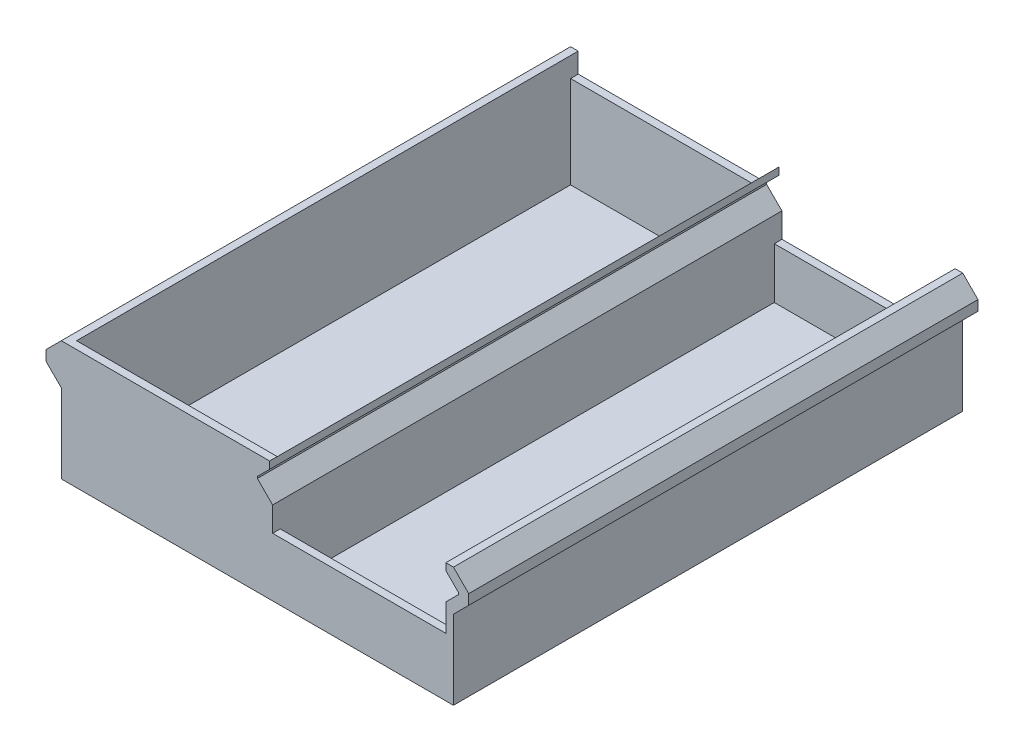
ISO-10303-21;
HEADER;
FILE_DESCRIPTION(('STEP AP214'),'2;1');
FILE_NAME('part.step','',(''),(''),'','','');
FILE_SCHEMA(('AUTOMOTIVE_DESIGN { 1 0 10303 214 1 1 1 1 }'));
ENDSEC;
DATA;
#1=APPLICATION_CONTEXT('core data for automotive mechanical design processes');
#2=APPLICATION_PROTOCOL_DEFINITION('international standard','automotive_design',2000,#1);
#3=PRODUCT_CONTEXT('',#1,'mechanical');
#4=PRODUCT('Part','Part','',(#3));
#5=PRODUCT_RELATED_PRODUCT_CATEGORY('part','',(#4));
#6=PRODUCT_DEFINITION_FORMATION('','',#4);
#7=PRODUCT_DEFINITION_CONTEXT('part definition',#1,'design');
#8=PRODUCT_DEFINITION('design','',#6,#7);
#9=PRODUCT_DEFINITION_SHAPE('','',#8);
#10=(LENGTH_UNIT() NAMED_UNIT(*) SI_UNIT(.MILLI.,.METRE.));
#11=(NAMED_UNIT(*) PLANE_ANGLE_UNIT() SI_UNIT($,.RADIAN.));
#12=(NAMED_UNIT(*) SI_UNIT($,.STERADIAN.) SOLID_ANGLE_UNIT());
#13=UNCERTAINTY_MEASURE_WITH_UNIT(LENGTH_MEASURE(1.E-05),#10,'distance_accuracy_value','');
#14=(GEOMETRIC_REPRESENTATION_CONTEXT(3) GLOBAL_UNCERTAINTY_ASSIGNED_CONTEXT((#13)) GLOBAL_UNIT_ASSIGNED_CONTEXT((#10,
#11,#12)) REPRESENTATION_CONTEXT('',''));
#15=CARTESIAN_POINT('',(0.,0.,0.));
#16=DIRECTION('',(0.,0.,1.));
#17=DIRECTION('',(1.,0.,0.));
#18=AXIS2_PLACEMENT_3D('',#15,#16,#17);
#19=CARTESIAN_POINT('',(-77.,47.,-200.));
#20=DIRECTION('',(0.,1.,0.));
#21=DIRECTION('',(-1.,0.,0.));
#22=AXIS2_PLACEMENT_3D('',#19,#20,#21);
#23=PLANE('',#22);
#24=DIRECTION('',(0.,0.,1.));
#25=VECTOR('',#24,1.);
#26=CARTESIAN_POINT('',(-74.,47.,-197.));
#27=LINE('',#26,#25);
#28=CARTESIAN_POINT('',(-74.,47.,-200.));
#29=VERTEX_POINT('',#28);
#30=CARTESIAN_POINT('',(-74.,47.,-3.));
#31=VERTEX_POINT('',#30);
#32=EDGE_CURVE('E386',#29,#31,#27,.T.);
#33=ORIENTED_EDGE('',*,*,#32,.F.);
#34=DIRECTION('',(-1.,0.,0.));
#35=VECTOR('',#34,1.);
#36=CARTESIAN_POINT('',(-77.,47.,-200.));
#37=LINE('',#36,#35);
#38=CARTESIAN_POINT('',(-77.,47.,-200.));
#39=VERTEX_POINT('',#38);
#40=EDGE_CURVE('E443',#29,#39,#37,.T.);
#41=ORIENTED_EDGE('',*,*,#40,.T.);
#42=DIRECTION('',(0.,0.,1.));
#43=VECTOR('',#42,1.);
#44=CARTESIAN_POINT('',(-77.,47.,-200.));
#45=LINE('',#44,#43);
#46=CARTESIAN_POINT('',(-77.,47.,0.));
#47=VERTEX_POINT('',#46);
#48=EDGE_CURVE('E493',#39,#47,#45,.T.);
#49=ORIENTED_EDGE('',*,*,#48,.T.);
#50=DIRECTION('',(-1.,0.,0.));
#51=VECTOR('',#50,1.);
#52=CARTESIAN_POINT('',(-77.,47.,0.));
#53=LINE('',#52,#51);
#54=CARTESIAN_POINT('',(4.79404690038704,47.,0.));
#55=VERTEX_POINT('',#54);
#56=EDGE_CURVE('E474',#55,#47,#53,.T.);
#57=ORIENTED_EDGE('',*,*,#56,.F.);
#58=DIRECTION('',(0.,0.,-1.));
#59=VECTOR('',#58,1.);
#60=CARTESIAN_POINT('',(4.79404690038704,47.,0.));
#61=LINE('',#60,#59);
#62=CARTESIAN_POINT('',(4.79404690038704,47.,-3.));
#63=VERTEX_POINT('',#62);
#64=EDGE_CURVE('E356',#55,#63,#61,.T.);
#65=ORIENTED_EDGE('',*,*,#64,.T.);
#66=DIRECTION('',(1.,0.,0.));
#67=VECTOR('',#66,1.);
#68=CARTESIAN_POINT('',(-74.,47.,-3.));
#69=LINE('',#68,#67);
#70=EDGE_CURVE('E58',#31,#63,#69,.T.);
#71=ORIENTED_EDGE('',*,*,#70,.F.);
#72=EDGE_LOOP('',(#33,#41,#49,#57,#65,#71));
#73=FACE_BOUND('',#72,.T.);
#74=ADVANCED_FACE('F43',(#73),#23,.T.);
#75=CARTESIAN_POINT('',(0.,0.,-200.));
#76=DIRECTION('',(0.,0.,-1.));
#77=DIRECTION('',(-1.,0.,0.));
#78=AXIS2_PLACEMENT_3D('',#75,#76,#77);
#79=PLANE('',#78);
#80=DIRECTION('',(-1.,0.,0.));
#81=VECTOR('',#80,1.);
#82=CARTESIAN_POINT('',(-3.,39.1715728752538,-200.));
#83=LINE('',#82,#81);
#84=CARTESIAN_POINT('',(-3.,39.1715728752538,-200.));
#85=VERTEX_POINT('',#84);
#86=CARTESIAN_POINT('',(-74.,39.1715728752538,-200.));
#87=VERTEX_POINT('',#86);
#88=EDGE_CURVE('E267',#85,#87,#83,.T.);
#89=ORIENTED_EDGE('',*,*,#88,.F.);
#90=DIRECTION('',(-0.707106781186547,-0.707106781186547,0.));
#91=VECTOR('',#90,1.);
#92=CARTESIAN_POINT('',(-3.,39.1715728752538,-200.));
#93=LINE('',#92,#91);
#94=CARTESIAN_POINT('',(4.79404690038704,46.9656197756409,-200.));
#95=VERTEX_POINT('',#94);
#96=EDGE_CURVE('E256',#95,#85,#93,.T.);
#97=ORIENTED_EDGE('',*,*,#96,.F.);
#98=DIRECTION('',(0.,1.,0.));
#99=VECTOR('',#98,1.);
#100=CARTESIAN_POINT('',(4.79404690038704,44.1371926508947,-200.));
#101=LINE('',#100,#99);
#102=CARTESIAN_POINT('',(4.79404690038704,44.1371926508947,-200.));
#103=VERTEX_POINT('',#102);
#104=EDGE_CURVE('E295',#103,#95,#101,.T.);
#105=ORIENTED_EDGE('',*,*,#104,.F.);
#106=DIRECTION('',(0.707106781186547,0.707106781186548,0.));
#107=VECTOR('',#106,1.);
#108=CARTESIAN_POINT('',(0.,39.3431457505076,-200.));
#109=LINE('',#108,#107);
#110=CARTESIAN_POINT('',(0.,39.3431457505076,-200.));
#111=VERTEX_POINT('',#110);
#112=EDGE_CURVE('E352',#111,#103,#109,.T.);
#113=ORIENTED_EDGE('',*,*,#112,.F.);
#114=DIRECTION('',(0.,1.,0.));
#115=VECTOR('',#114,1.);
#116=CARTESIAN_POINT('',(0.,38.6568542494924,-200.));
#117=LINE('',#116,#115);
#118=CARTESIAN_POINT('',(0.,38.6568542494924,-200.));
#119=VERTEX_POINT('',#118);
#120=EDGE_CURVE('E349',#119,#111,#117,.T.);
#121=ORIENTED_EDGE('',*,*,#120,.F.);
#122=DIRECTION('',(-0.707106781186547,0.707106781186548,0.));
#123=VECTOR('',#122,1.);
#124=CARTESIAN_POINT('',(6.00000000000001,32.6568542494924,-200.));
#125=LINE('',#124,#123);
#126=CARTESIAN_POINT('',(6.00000000000001,32.6568542494924,-200.));
#127=VERTEX_POINT('',#126);
#128=EDGE_CURVE('E346',#127,#119,#125,.T.);
#129=ORIENTED_EDGE('',*,*,#128,.F.);
#130=DIRECTION('',(0.,1.,0.));
#131=VECTOR('',#130,1.);
#132=CARTESIAN_POINT('',(6.00000000000001,23.,-200.));
#133=LINE('',#132,#131);
#134=CARTESIAN_POINT('',(6.00000000000001,23.,-200.));
#135=VERTEX_POINT('',#134);
#136=EDGE_CURVE('E343',#135,#127,#133,.T.);
#137=ORIENTED_EDGE('',*,*,#136,.F.);
#138=DIRECTION('',(-1.,0.,0.));
#139=VECTOR('',#138,1.);
#140=CARTESIAN_POINT('',(74.,23.,-200.));
#141=LINE('',#140,#139);
#142=CARTESIAN_POINT('',(74.,23.,-200.));
#143=VERTEX_POINT('',#142);
#144=EDGE_CURVE('E340',#143,#135,#141,.T.);
#145=ORIENTED_EDGE('',*,*,#144,.F.);
#146=DIRECTION('',(0.,-1.,0.));
#147=VECTOR('',#146,1.);
#148=CARTESIAN_POINT('',(74.,33.6568542494924,-200.));
#149=LINE('',#148,#147);
#150=CARTESIAN_POINT('',(74.,33.6568542494924,-200.));
#151=VERTEX_POINT('',#150);
#152=EDGE_CURVE('E337',#151,#143,#149,.T.);
#153=ORIENTED_EDGE('',*,*,#152,.F.);
#154=DIRECTION('',(-0.707106781186548,-0.707106781186548,0.));
#155=VECTOR('',#154,1.);
#156=CARTESIAN_POINT('',(79.,38.6568542494924,-200.));
#157=LINE('',#156,#155);
#158=CARTESIAN_POINT('',(79.,38.6568542494924,-200.));
#159=VERTEX_POINT('',#158);
#160=EDGE_CURVE('E334',#159,#151,#157,.T.);
#161=ORIENTED_EDGE('',*,*,#160,.F.);
#162=DIRECTION('',(0.,-1.,0.));
#163=VECTOR('',#162,1.);
#164=CARTESIAN_POINT('',(79.,39.3431457505077,-200.));
#165=LINE('',#164,#163);
#166=CARTESIAN_POINT('',(79.,39.3431457505077,-200.));
#167=VERTEX_POINT('',#166);
#168=EDGE_CURVE('E331',#167,#159,#165,.T.);
#169=ORIENTED_EDGE('',*,*,#168,.F.);
#170=DIRECTION('',(0.707106781186548,-0.707106781186548,0.));
#171=VECTOR('',#170,1.);
#172=CARTESIAN_POINT('',(74.,44.3431457505076,-200.));
#173=LINE('',#172,#171);
#174=CARTESIAN_POINT('',(74.,44.3431457505076,-200.));
#175=VERTEX_POINT('',#174);
#176=EDGE_CURVE('E328',#175,#167,#173,.T.);
#177=ORIENTED_EDGE('',*,*,#176,.F.);
#178=DIRECTION('',(0.,-1.,0.));
#179=VECTOR('',#178,1.);
#180=CARTESIAN_POINT('',(74.,47.,-200.));
#181=LINE('',#180,#179);
#182=CARTESIAN_POINT('',(74.,47.,-200.));
#183=VERTEX_POINT('',#182);
#184=EDGE_CURVE('E290',#183,#175,#181,.T.);
#185=ORIENTED_EDGE('',*,*,#184,.F.);
#186=CARTESIAN_POINT('',(77.,47.,-200.));
#187=VERTEX_POINT('',#186);
#188=EDGE_CURVE('E444',#187,#183,#37,.T.);
#189=ORIENTED_EDGE('',*,*,#188,.F.);
#190=DIRECTION('',(-0.707106781186546,0.70710678118655,0.));
#191=VECTOR('',#190,1.);
#192=CARTESIAN_POINT('',(83.,41.,-200.));
#193=LINE('',#192,#191);
#194=CARTESIAN_POINT('',(83.,41.,-200.));
#195=VERTEX_POINT('',#194);
#196=EDGE_CURVE('E440',#195,#187,#193,.T.);
#197=ORIENTED_EDGE('',*,*,#196,.F.);
#198=DIRECTION('',(0.,1.,0.));
#199=VECTOR('',#198,1.);
#200=CARTESIAN_POINT('',(83.,37.,-200.));
#201=LINE('',#200,#199);
#202=CARTESIAN_POINT('',(83.,37.,-200.));
#203=VERTEX_POINT('',#202);
#204=EDGE_CURVE('E437',#203,#195,#201,.T.);
#205=ORIENTED_EDGE('',*,*,#204,.F.);
#206=DIRECTION('',(0.707106781186549,0.707106781186546,0.));
#207=VECTOR('',#206,1.);
#208=CARTESIAN_POINT('',(77.,31.,-200.));
#209=LINE('',#208,#207);
#210=CARTESIAN_POINT('',(77.,31.,-200.));
#211=VERTEX_POINT('',#210);
#212=EDGE_CURVE('E434',#211,#203,#209,.T.);
#213=ORIENTED_EDGE('',*,*,#212,.F.);
#214=DIRECTION('',(0.,1.,0.));
#215=VECTOR('',#214,1.);
#216=CARTESIAN_POINT('',(77.,0.,-200.));
#217=LINE('',#216,#215);
#218=CARTESIAN_POINT('',(77.,0.,-200.));
#219=VERTEX_POINT('',#218);
#220=EDGE_CURVE('E431',#219,#211,#217,.T.);
#221=ORIENTED_EDGE('',*,*,#220,.F.);
#222=DIRECTION('',(1.,0.,0.));
#223=VECTOR('',#222,1.);
#224=CARTESIAN_POINT('',(77.,0.,-200.));
#225=LINE('',#224,#223);
#226=CARTESIAN_POINT('',(-77.,0.,-200.));
#227=VERTEX_POINT('',#226);
#228=EDGE_CURVE('E427',#227,#219,#225,.T.);
#229=ORIENTED_EDGE('',*,*,#228,.F.);
#230=DIRECTION('',(0.,-1.,0.));
#231=VECTOR('',#230,1.);
#232=CARTESIAN_POINT('',(-77.,0.,-200.));
#233=LINE('',#232,#231);
#234=CARTESIAN_POINT('',(-77.,31.,-200.));
#235=VERTEX_POINT('',#234);
#236=EDGE_CURVE('E424',#235,#227,#233,.T.);
#237=ORIENTED_EDGE('',*,*,#236,.F.);
#238=DIRECTION('',(0.707106781186549,-0.707106781186546,0.));
#239=VECTOR('',#238,1.);
#240=CARTESIAN_POINT('',(-77.,31.,-200.));
#241=LINE('',#240,#239);
#242=CARTESIAN_POINT('',(-83.,37.,-200.));
#243=VERTEX_POINT('',#242);
#244=EDGE_CURVE('E453',#243,#235,#241,.T.);
#245=ORIENTED_EDGE('',*,*,#244,.F.);
#246=DIRECTION('',(0.,-1.,0.));
#247=VECTOR('',#246,1.);
#248=CARTESIAN_POINT('',(-83.,37.,-200.));
#249=LINE('',#248,#247);
#250=CARTESIAN_POINT('',(-83.,41.,-200.));
#251=VERTEX_POINT('',#250);
#252=EDGE_CURVE('E450',#251,#243,#249,.T.);
#253=ORIENTED_EDGE('',*,*,#252,.F.);
#254=DIRECTION('',(-0.707106781186546,-0.70710678118655,0.));
#255=VECTOR('',#254,1.);
#256=CARTESIAN_POINT('',(-83.,41.,-200.));
#257=LINE('',#256,#255);
#258=EDGE_CURVE('E447',#39,#251,#257,.T.);
#259=ORIENTED_EDGE('',*,*,#258,.F.);
#260=ORIENTED_EDGE('',*,*,#40,.F.);
#261=DIRECTION('',(0.,1.,0.));
#262=VECTOR('',#261,1.);
#263=CARTESIAN_POINT('',(-74.,39.1715728752538,-200.));
#264=LINE('',#263,#262);
#265=EDGE_CURVE('E281',#87,#29,#264,.T.);
#266=ORIENTED_EDGE('',*,*,#265,.F.);
#267=EDGE_LOOP('',(#89,#97,#105,#113,#121,#129,#137,#145,#153,#161,#169,#177,#185,#189,#197,
#205,#213,#221,#229,#237,#245,#253,#259,#260,#266));
#268=FACE_BOUND('',#267,.T.);
#269=ADVANCED_FACE('F278',(#268),#79,.T.);
#270=CARTESIAN_POINT('',(74.,-244.008196583639,-197.));
#271=DIRECTION('',(0.,0.,-1.));
#272=DIRECTION('',(-1.,0.,0.));
#273=AXIS2_PLACEMENT_3D('',#270,#271,#272);
#274=PLANE('',#273);
#275=DIRECTION('',(1.,0.,0.));
#276=VECTOR('',#275,1.);
#277=CARTESIAN_POINT('',(74.,39.1715728752538,-197.));
#278=LINE('',#277,#276);
#279=CARTESIAN_POINT('',(-74.,39.1715728752538,-197.));
#280=VERTEX_POINT('',#279);
#281=CARTESIAN_POINT('',(-3.,39.1715728752538,-197.));
#282=VERTEX_POINT('',#281);
#283=EDGE_CURVE('E274',#280,#282,#278,.T.);
#284=ORIENTED_EDGE('',*,*,#283,.F.);
#285=DIRECTION('',(0.,1.,0.));
#286=VECTOR('',#285,1.);
#287=CARTESIAN_POINT('',(-74.,-244.008196583639,-197.));
#288=LINE('',#287,#286);
#289=CARTESIAN_POINT('',(-74.,2.99999999999998,-197.));
#290=VERTEX_POINT('',#289);
#291=EDGE_CURVE('E407',#290,#280,#288,.T.);
#292=ORIENTED_EDGE('',*,*,#291,.F.);
#293=DIRECTION('',(-1.,0.,0.));
#294=VECTOR('',#293,1.);
#295=CARTESIAN_POINT('',(74.,3.,-197.));
#296=LINE('',#295,#294);
#297=CARTESIAN_POINT('',(-3.,2.99999999999999,-197.));
#298=VERTEX_POINT('',#297);
#299=EDGE_CURVE('E411',#298,#290,#296,.T.);
#300=ORIENTED_EDGE('',*,*,#299,.F.);
#301=DIRECTION('',(0.,-1.,0.));
#302=VECTOR('',#301,1.);
#303=CARTESIAN_POINT('',(-3.,241.208650682713,-197.));
#304=LINE('',#303,#302);
#305=EDGE_CURVE('E389',#282,#298,#304,.T.);
#306=ORIENTED_EDGE('',*,*,#305,.F.);
#307=EDGE_LOOP('',(#284,#292,#300,#306));
#308=FACE_BOUND('',#307,.T.);
#309=ADVANCED_FACE('F613',(#308),#274,.F.);
#310=CARTESIAN_POINT('',(-3.,241.208650682713,-3.));
#311=DIRECTION('',(-1.,0.,0.));
#312=DIRECTION('',(0.,0.,1.));
#313=AXIS2_PLACEMENT_3D('',#310,#311,#312);
#314=PLANE('',#313);
#315=DIRECTION('',(0.,-1.,0.));
#316=VECTOR('',#315,1.);
#317=CARTESIAN_POINT('',(-3.,241.208650682713,-3.));
#318=LINE('',#317,#316);
#319=CARTESIAN_POINT('',(-3.,39.1715728752538,-3.));
#320=VERTEX_POINT('',#319);
#321=CARTESIAN_POINT('',(-3.,2.99999999999998,-3.));
#322=VERTEX_POINT('',#321);
#323=EDGE_CURVE('E383',#320,#322,#318,.T.);
#324=ORIENTED_EDGE('',*,*,#323,.F.);
#325=DIRECTION('',(0.,0.,1.));
#326=VECTOR('',#325,1.);
#327=CARTESIAN_POINT('',(-3.,39.1715728752538,-200.));
#328=LINE('',#327,#326);
#329=EDGE_CURVE('E275',#282,#320,#328,.T.);
#330=ORIENTED_EDGE('',*,*,#329,.F.);
#331=ORIENTED_EDGE('',*,*,#305,.T.);
#332=DIRECTION('',(0.,0.,-1.));
#333=VECTOR('',#332,1.);
#334=CARTESIAN_POINT('',(-3.,2.99999999999999,-3.));
#335=LINE('',#334,#333);
#336=EDGE_CURVE('E380',#322,#298,#335,.T.);
#337=ORIENTED_EDGE('',*,*,#336,.F.);
#338=EDGE_LOOP('',(#324,#330,#331,#337));
#339=FACE_BOUND('',#338,.T.);
#340=ADVANCED_FACE('F624',(#339),#314,.T.);
#341=CARTESIAN_POINT('',(4.79404690038704,44.1371926508947,0.));
#342=DIRECTION('',(-1.,0.,0.));
#343=DIRECTION('',(0.,-1.,0.));
#344=AXIS2_PLACEMENT_3D('',#341,#342,#343);
#345=PLANE('',#344);
#346=DIRECTION('',(0.,0.,-1.));
#347=VECTOR('',#346,1.);
#348=CARTESIAN_POINT('',(4.79404690038704,46.9656197756409,0.));
#349=LINE('',#348,#347);
#350=CARTESIAN_POINT('',(4.79404690038704,46.9656197756409,-3.));
#351=VERTEX_POINT('',#350);
#352=EDGE_CURVE('E12',#351,#95,#349,.T.);
#353=ORIENTED_EDGE('',*,*,#352,.F.);
#354=DIRECTION('',(0.,1.,0.));
#355=VECTOR('',#354,1.);
#356=CARTESIAN_POINT('',(4.79404690038704,44.1371926508947,-3.));
#357=LINE('',#356,#355);
#358=EDGE_CURVE('E51',#351,#63,#357,.T.);
#359=ORIENTED_EDGE('',*,*,#358,.T.);
#360=ORIENTED_EDGE('',*,*,#64,.F.);
#361=DIRECTION('',(0.,1.,0.));
#362=VECTOR('',#361,1.);
#363=CARTESIAN_POINT('',(4.79404690038704,44.1371926508947,0.));
#364=LINE('',#363,#362);
#365=CARTESIAN_POINT('',(4.79404690038704,44.1371926508947,0.));
#366=VERTEX_POINT('',#365);
#367=EDGE_CURVE('E322',#366,#55,#364,.T.);
#368=ORIENTED_EDGE('',*,*,#367,.F.);
#369=DIRECTION('',(0.,0.,-1.));
#370=VECTOR('',#369,1.);
#371=CARTESIAN_POINT('',(4.79404690038704,44.1371926508947,0.));
#372=LINE('',#371,#370);
#373=EDGE_CURVE('E360',#366,#103,#372,.T.);
#374=ORIENTED_EDGE('',*,*,#373,.T.);
#375=ORIENTED_EDGE('',*,*,#104,.T.);
#376=EDGE_LOOP('',(#353,#359,#360,#368,#374,#375));
#377=FACE_BOUND('',#376,.T.);
#378=ADVANCED_FACE('F512',(#377),#345,.F.);
#379=CARTESIAN_POINT('',(-77.,0.,-200.));
#380=DIRECTION('',(-1.,0.,0.));
#381=DIRECTION('',(0.,0.,1.));
#382=AXIS2_PLACEMENT_3D('',#379,#380,#381);
#383=PLANE('',#382);
#384=DIRECTION('',(0.,-1.,0.));
#385=VECTOR('',#384,1.);
#386=CARTESIAN_POINT('',(-77.,0.,0.));
#387=LINE('',#386,#385);
#388=CARTESIAN_POINT('',(-77.,31.,0.));
#389=VERTEX_POINT('',#388);
#390=CARTESIAN_POINT('',(-77.,0.,0.));
#391=VERTEX_POINT('',#390);
#392=EDGE_CURVE('E423',#389,#391,#387,.T.);
#393=ORIENTED_EDGE('',*,*,#392,.F.);
#394=DIRECTION('',(0.,0.,1.));
#395=VECTOR('',#394,1.);
#396=CARTESIAN_POINT('',(-77.,31.,-200.));
#397=LINE('',#396,#395);
#398=EDGE_CURVE('E486',#235,#389,#397,.T.);
#399=ORIENTED_EDGE('',*,*,#398,.F.);
#400=ORIENTED_EDGE('',*,*,#236,.T.);
#401=DIRECTION('',(0.,0.,1.));
#402=VECTOR('',#401,1.);
#403=CARTESIAN_POINT('',(-77.,0.,-200.));
#404=LINE('',#403,#402);
#405=EDGE_CURVE('E456',#227,#391,#404,.T.);
#406=ORIENTED_EDGE('',*,*,#405,.T.);
#407=EDGE_LOOP('',(#393,#399,#400,#406));
#408=FACE_BOUND('',#407,.T.);
#409=ADVANCED_FACE('F45',(#408),#383,.T.);
#410=CARTESIAN_POINT('',(-77.,31.,-200.));
#411=DIRECTION('',(-0.707106781186546,-0.707106781186549,0.));
#412=DIRECTION('',(0.707106781186549,-0.707106781186546,0.));
#413=AXIS2_PLACEMENT_3D('',#410,#411,#412);
#414=PLANE('',#413);
#415=DIRECTION('',(0.707106781186549,-0.707106781186546,0.));
#416=VECTOR('',#415,1.);
#417=CARTESIAN_POINT('',(-77.,31.,0.));
#418=LINE('',#417,#416);
#419=CARTESIAN_POINT('',(-83.,37.,0.));
#420=VERTEX_POINT('',#419);
#421=EDGE_CURVE('E428',#420,#389,#418,.T.);
#422=ORIENTED_EDGE('',*,*,#421,.F.);
#423=DIRECTION('',(0.,0.,1.));
#424=VECTOR('',#423,1.);
#425=CARTESIAN_POINT('',(-83.,37.,-200.));
#426=LINE('',#425,#424);
#427=EDGE_CURVE('E489',#243,#420,#426,.T.);
#428=ORIENTED_EDGE('',*,*,#427,.F.);
#429=ORIENTED_EDGE('',*,*,#244,.T.);
#430=ORIENTED_EDGE('',*,*,#398,.T.);
#431=EDGE_LOOP('',(#422,#428,#429,#430));
#432=FACE_BOUND('',#431,.T.);
#433=ADVANCED_FACE('F591',(#432),#414,.T.);
#434=CARTESIAN_POINT('',(-83.,37.,-200.));
#435=DIRECTION('',(-1.,0.,0.));
#436=DIRECTION('',(0.,-1.,0.));
#437=AXIS2_PLACEMENT_3D('',#434,#435,#436);
#438=PLANE('',#437);
#439=DIRECTION('',(0.,-1.,0.));
#440=VECTOR('',#439,1.);
#441=CARTESIAN_POINT('',(-83.,37.,0.));
#442=LINE('',#441,#440);
#443=CARTESIAN_POINT('',(-83.,41.,0.));
#444=VERTEX_POINT('',#443);
#445=EDGE_CURVE('E481',#444,#420,#442,.T.);
#446=ORIENTED_EDGE('',*,*,#445,.F.);
#447=DIRECTION('',(0.,0.,1.));
#448=VECTOR('',#447,1.);
#449=CARTESIAN_POINT('',(-83.,41.,-200.));
#450=LINE('',#449,#448);
#451=EDGE_CURVE('E491',#251,#444,#450,.T.);
#452=ORIENTED_EDGE('',*,*,#451,.F.);
#453=ORIENTED_EDGE('',*,*,#252,.T.);
#454=ORIENTED_EDGE('',*,*,#427,.T.);
#455=EDGE_LOOP('',(#446,#452,#453,#454));
#456=FACE_BOUND('',#455,.T.);
#457=ADVANCED_FACE('F598',(#456),#438,.T.);
#458=CARTESIAN_POINT('',(-83.,41.,-200.));
#459=DIRECTION('',(-0.70710678118655,0.707106781186545,0.));
#460=DIRECTION('',(-0.707106781186545,-0.70710678118655,0.));
#461=AXIS2_PLACEMENT_3D('',#458,#459,#460);
#462=PLANE('',#461);
#463=DIRECTION('',(-0.707106781186546,-0.70710678118655,0.));
#464=VECTOR('',#463,1.);
#465=CARTESIAN_POINT('',(-83.,41.,0.));
#466=LINE('',#465,#464);
#467=EDGE_CURVE('E478',#47,#444,#466,.T.);
#468=ORIENTED_EDGE('',*,*,#467,.F.);
#469=ORIENTED_EDGE('',*,*,#48,.F.);
#470=ORIENTED_EDGE('',*,*,#258,.T.);
#471=ORIENTED_EDGE('',*,*,#451,.T.);
#472=EDGE_LOOP('',(#468,#469,#470,#471));
#473=FACE_BOUND('',#472,.T.);
#474=ADVANCED_FACE('F596',(#473),#462,.T.);
#475=DIRECTION('',(0.,0.,-1.));
#476=VECTOR('',#475,1.);
#477=CARTESIAN_POINT('',(74.,47.,-3.));
#478=LINE('',#477,#476);
#479=CARTESIAN_POINT('',(74.,47.,0.));
#480=VERTEX_POINT('',#479);
#481=EDGE_CURVE('E393',#480,#183,#478,.T.);
#482=ORIENTED_EDGE('',*,*,#481,.F.);
#483=CARTESIAN_POINT('',(77.,47.,0.));
#484=VERTEX_POINT('',#483);
#485=EDGE_CURVE('E475',#484,#480,#53,.T.);
#486=ORIENTED_EDGE('',*,*,#485,.F.);
#487=DIRECTION('',(0.,0.,1.));
#488=VECTOR('',#487,1.);
#489=CARTESIAN_POINT('',(77.,47.,-200.));
#490=LINE('',#489,#488);
#491=EDGE_CURVE('E496',#187,#484,#490,.T.);
#492=ORIENTED_EDGE('',*,*,#491,.F.);
#493=ORIENTED_EDGE('',*,*,#188,.T.);
#494=EDGE_LOOP('',(#482,#486,#492,#493));
#495=FACE_BOUND('',#494,.T.);
#496=ADVANCED_FACE('F564',(#495),#23,.T.);
#497=CARTESIAN_POINT('',(83.,41.,-200.));
#498=DIRECTION('',(0.70710678118655,0.707106781186545,0.));
#499=DIRECTION('',(-0.707106781186545,0.70710678118655,0.));
#500=AXIS2_PLACEMENT_3D('',#497,#498,#499);
#501=PLANE('',#500);
#502=DIRECTION('',(-0.707106781186546,0.70710678118655,0.));
#503=VECTOR('',#502,1.);
#504=CARTESIAN_POINT('',(83.,41.,0.));
#505=LINE('',#504,#503);
#506=CARTESIAN_POINT('',(83.,41.,0.));
#507=VERTEX_POINT('',#506);
#508=EDGE_CURVE('E471',#507,#484,#505,.T.);
#509=ORIENTED_EDGE('',*,*,#508,.F.);
#510=DIRECTION('',(0.,0.,1.));
#511=VECTOR('',#510,1.);
#512=CARTESIAN_POINT('',(83.,41.,-200.));
#513=LINE('',#512,#511);
#514=EDGE_CURVE('E498',#195,#507,#513,.T.);
#515=ORIENTED_EDGE('',*,*,#514,.F.);
#516=ORIENTED_EDGE('',*,*,#196,.T.);
#517=ORIENTED_EDGE('',*,*,#491,.T.);
#518=EDGE_LOOP('',(#509,#515,#516,#517));
#519=FACE_BOUND('',#518,.T.);
#520=ADVANCED_FACE('F568',(#519),#501,.T.);
#521=CARTESIAN_POINT('',(83.,37.,-200.));
#522=DIRECTION('',(1.,0.,0.));
#523=DIRECTION('',(0.,1.,0.));
#524=AXIS2_PLACEMENT_3D('',#521,#522,#523);
#525=PLANE('',#524);
#526=DIRECTION('',(0.,1.,0.));
#527=VECTOR('',#526,1.);
#528=CARTESIAN_POINT('',(83.,37.,0.));
#529=LINE('',#528,#527);
#530=CARTESIAN_POINT('',(83.,37.,0.));
#531=VERTEX_POINT('',#530);
#532=EDGE_CURVE('E468',#531,#507,#529,.T.);
#533=ORIENTED_EDGE('',*,*,#532,.F.);
#534=DIRECTION('',(0.,0.,1.));
#535=VECTOR('',#534,1.);
#536=CARTESIAN_POINT('',(83.,37.,-200.));
#537=LINE('',#536,#535);
#538=EDGE_CURVE('E500',#203,#531,#537,.T.);
#539=ORIENTED_EDGE('',*,*,#538,.F.);
#540=ORIENTED_EDGE('',*,*,#204,.T.);
#541=ORIENTED_EDGE('',*,*,#514,.T.);
#542=EDGE_LOOP('',(#533,#539,#540,#541));
#543=FACE_BOUND('',#542,.T.);
#544=ADVANCED_FACE('F573',(#543),#525,.T.);
#545=CARTESIAN_POINT('',(77.,31.,-200.));
#546=DIRECTION('',(0.707106781186547,-0.707106781186549,0.));
#547=DIRECTION('',(0.707106781186549,0.707106781186547,0.));
#548=AXIS2_PLACEMENT_3D('',#545,#546,#547);
#549=PLANE('',#548);
#550=DIRECTION('',(0.707106781186549,0.707106781186546,0.));
#551=VECTOR('',#550,1.);
#552=CARTESIAN_POINT('',(77.,31.,0.));
#553=LINE('',#552,#551);
#554=CARTESIAN_POINT('',(77.,31.,0.));
#555=VERTEX_POINT('',#554);
#556=EDGE_CURVE('E465',#555,#531,#553,.T.);
#557=ORIENTED_EDGE('',*,*,#556,.F.);
#558=DIRECTION('',(0.,0.,1.));
#559=VECTOR('',#558,1.);
#560=CARTESIAN_POINT('',(77.,31.,-200.));
#561=LINE('',#560,#559);
#562=EDGE_CURVE('E502',#211,#555,#561,.T.);
#563=ORIENTED_EDGE('',*,*,#562,.F.);
#564=ORIENTED_EDGE('',*,*,#212,.T.);
#565=ORIENTED_EDGE('',*,*,#538,.T.);
#566=EDGE_LOOP('',(#557,#563,#564,#565));
#567=FACE_BOUND('',#566,.T.);
#568=ADVANCED_FACE('F576',(#567),#549,.T.);
#569=CARTESIAN_POINT('',(77.,0.,-200.));
#570=DIRECTION('',(1.,0.,0.));
#571=DIRECTION('',(0.,0.,-1.));
#572=AXIS2_PLACEMENT_3D('',#569,#570,#571);
#573=PLANE('',#572);
#574=DIRECTION('',(0.,1.,0.));
#575=VECTOR('',#574,1.);
#576=CARTESIAN_POINT('',(77.,0.,0.));
#577=LINE('',#576,#575);
#578=CARTESIAN_POINT('',(77.,0.,0.));
#579=VERTEX_POINT('',#578);
#580=EDGE_CURVE('E462',#579,#555,#577,.T.);
#581=ORIENTED_EDGE('',*,*,#580,.F.);
#582=DIRECTION('',(0.,0.,1.));
#583=VECTOR('',#582,1.);
#584=CARTESIAN_POINT('',(77.,0.,-200.));
#585=LINE('',#584,#583);
#586=EDGE_CURVE('E504',#219,#579,#585,.T.);
#587=ORIENTED_EDGE('',*,*,#586,.F.);
#588=ORIENTED_EDGE('',*,*,#220,.T.);
#589=ORIENTED_EDGE('',*,*,#562,.T.);
#590=EDGE_LOOP('',(#581,#587,#588,#589));
#591=FACE_BOUND('',#590,.T.);
#592=ADVANCED_FACE('F581',(#591),#573,.T.);
#593=CARTESIAN_POINT('',(77.,0.,-200.));
#594=DIRECTION('',(0.,-1.,0.));
#595=DIRECTION('',(1.,0.,0.));
#596=AXIS2_PLACEMENT_3D('',#593,#594,#595);
#597=PLANE('',#596);
#598=DIRECTION('',(1.,0.,0.));
#599=VECTOR('',#598,1.);
#600=CARTESIAN_POINT('',(77.,0.,0.));
#601=LINE('',#600,#599);
#602=EDGE_CURVE('E459',#391,#579,#601,.T.);
#603=ORIENTED_EDGE('',*,*,#602,.F.);
#604=ORIENTED_EDGE('',*,*,#405,.F.);
#605=ORIENTED_EDGE('',*,*,#228,.T.);
#606=ORIENTED_EDGE('',*,*,#586,.T.);
#607=EDGE_LOOP('',(#603,#604,#605,#606));
#608=FACE_BOUND('',#607,.T.);
#609=ADVANCED_FACE('F584',(#608),#597,.T.);
#610=CARTESIAN_POINT('',(0.,0.,0.));
#611=DIRECTION('',(0.,0.,-1.));
#612=DIRECTION('',(-1.,0.,0.));
#613=AXIS2_PLACEMENT_3D('',#610,#611,#612);
#614=PLANE('',#613);
#615=DIRECTION('',(0.707106781186547,0.707106781186548,0.));
#616=VECTOR('',#615,1.);
#617=CARTESIAN_POINT('',(0.,39.3431457505076,0.));
#618=LINE('',#617,#616);
#619=CARTESIAN_POINT('',(0.,39.3431457505076,0.));
#620=VERTEX_POINT('',#619);
#621=EDGE_CURVE('E319',#620,#366,#618,.T.);
#622=ORIENTED_EDGE('',*,*,#621,.T.);
#623=ORIENTED_EDGE('',*,*,#367,.T.);
#624=ORIENTED_EDGE('',*,*,#56,.T.);
#625=ORIENTED_EDGE('',*,*,#467,.T.);
#626=ORIENTED_EDGE('',*,*,#445,.T.);
#627=ORIENTED_EDGE('',*,*,#421,.T.);
#628=ORIENTED_EDGE('',*,*,#392,.T.);
#629=ORIENTED_EDGE('',*,*,#602,.T.);
#630=ORIENTED_EDGE('',*,*,#580,.T.);
#631=ORIENTED_EDGE('',*,*,#556,.T.);
#632=ORIENTED_EDGE('',*,*,#532,.T.);
#633=ORIENTED_EDGE('',*,*,#508,.T.);
#634=ORIENTED_EDGE('',*,*,#485,.T.);
#635=DIRECTION('',(0.,-1.,0.));
#636=VECTOR('',#635,1.);
#637=CARTESIAN_POINT('',(74.,47.,0.));
#638=LINE('',#637,#636);
#639=CARTESIAN_POINT('',(74.,44.3431457505076,0.));
#640=VERTEX_POINT('',#639);
#641=EDGE_CURVE('E291',#480,#640,#638,.T.);
#642=ORIENTED_EDGE('',*,*,#641,.T.);
#643=DIRECTION('',(0.707106781186548,-0.707106781186548,0.));
#644=VECTOR('',#643,1.);
#645=CARTESIAN_POINT('',(74.,44.3431457505076,0.));
#646=LINE('',#645,#644);
#647=CARTESIAN_POINT('',(79.,39.3431457505077,0.));
#648=VERTEX_POINT('',#647);
#649=EDGE_CURVE('E294',#640,#648,#646,.T.);
#650=ORIENTED_EDGE('',*,*,#649,.T.);
#651=DIRECTION('',(0.,-1.,0.));
#652=VECTOR('',#651,1.);
#653=CARTESIAN_POINT('',(79.,39.3431457505077,0.));
#654=LINE('',#653,#652);
#655=CARTESIAN_POINT('',(79.,38.6568542494924,0.));
#656=VERTEX_POINT('',#655);
#657=EDGE_CURVE('E298',#648,#656,#654,.T.);
#658=ORIENTED_EDGE('',*,*,#657,.T.);
#659=DIRECTION('',(-0.707106781186548,-0.707106781186548,0.));
#660=VECTOR('',#659,1.);
#661=CARTESIAN_POINT('',(79.,38.6568542494924,0.));
#662=LINE('',#661,#660);
#663=CARTESIAN_POINT('',(74.,33.6568542494924,0.));
#664=VERTEX_POINT('',#663);
#665=EDGE_CURVE('E301',#656,#664,#662,.T.);
#666=ORIENTED_EDGE('',*,*,#665,.T.);
#667=DIRECTION('',(0.,-1.,0.));
#668=VECTOR('',#667,1.);
#669=CARTESIAN_POINT('',(74.,33.6568542494924,0.));
#670=LINE('',#669,#668);
#671=CARTESIAN_POINT('',(74.,23.,0.));
#672=VERTEX_POINT('',#671);
#673=EDGE_CURVE('E304',#664,#672,#670,.T.);
#674=ORIENTED_EDGE('',*,*,#673,.T.);
#675=DIRECTION('',(-1.,0.,0.));
#676=VECTOR('',#675,1.);
#677=CARTESIAN_POINT('',(74.,23.,0.));
#678=LINE('',#677,#676);
#679=CARTESIAN_POINT('',(6.00000000000001,23.,0.));
#680=VERTEX_POINT('',#679);
#681=EDGE_CURVE('E307',#672,#680,#678,.T.);
#682=ORIENTED_EDGE('',*,*,#681,.T.);
#683=DIRECTION('',(0.,1.,0.));
#684=VECTOR('',#683,1.);
#685=CARTESIAN_POINT('',(6.00000000000001,23.,0.));
#686=LINE('',#685,#684);
#687=CARTESIAN_POINT('',(6.00000000000001,32.6568542494924,0.));
#688=VERTEX_POINT('',#687);
#689=EDGE_CURVE('E310',#680,#688,#686,.T.);
#690=ORIENTED_EDGE('',*,*,#689,.T.);
#691=DIRECTION('',(-0.707106781186547,0.707106781186548,0.));
#692=VECTOR('',#691,1.);
#693=CARTESIAN_POINT('',(6.00000000000001,32.6568542494924,0.));
#694=LINE('',#693,#692);
#695=CARTESIAN_POINT('',(0.,38.6568542494924,0.));
#696=VERTEX_POINT('',#695);
#697=EDGE_CURVE('E313',#688,#696,#694,.T.);
#698=ORIENTED_EDGE('',*,*,#697,.T.);
#699=DIRECTION('',(0.,1.,0.));
#700=VECTOR('',#699,1.);
#701=CARTESIAN_POINT('',(0.,38.6568542494924,0.));
#702=LINE('',#701,#700);
#703=EDGE_CURVE('E316',#696,#620,#702,.T.);
#704=ORIENTED_EDGE('',*,*,#703,.T.);
#705=EDGE_LOOP('',(#622,#623,#624,#625,#626,#627,#628,#629,#630,#631,#632,#633,#634,#642,#650,
#658,#666,#674,#682,#690,#698,#704));
#706=FACE_BOUND('',#705,.T.);
#707=ADVANCED_FACE('F519',(#706),#614,.F.);
#708=CARTESIAN_POINT('',(77.,3.,-200.));
#709=DIRECTION('',(0.,-1.,0.));
#710=DIRECTION('',(1.,0.,0.));
#711=AXIS2_PLACEMENT_3D('',#708,#709,#710);
#712=PLANE('',#711);
#713=DIRECTION('',(1.,0.,0.));
#714=VECTOR('',#713,1.);
#715=CARTESIAN_POINT('',(-74.0000000000001,2.99999999999998,-3.));
#716=LINE('',#715,#714);
#717=CARTESIAN_POINT('',(-74.,2.99999999999998,-3.));
#718=VERTEX_POINT('',#717);
#719=EDGE_CURVE('E399',#718,#322,#716,.T.);
#720=ORIENTED_EDGE('',*,*,#719,.T.);
#721=ORIENTED_EDGE('',*,*,#336,.T.);
#722=ORIENTED_EDGE('',*,*,#299,.T.);
#723=DIRECTION('',(0.,0.,1.));
#724=VECTOR('',#723,1.);
#725=CARTESIAN_POINT('',(-74.,2.99999999999998,-197.));
#726=LINE('',#725,#724);
#727=EDGE_CURVE('E403',#290,#718,#726,.T.);
#728=ORIENTED_EDGE('',*,*,#727,.T.);
#729=EDGE_LOOP('',(#720,#721,#722,#728));
#730=FACE_BOUND('',#729,.T.);
#731=ADVANCED_FACE('F649',(#730),#712,.F.);
#732=CARTESIAN_POINT('',(-74.,-244.008196583639,-3.));
#733=DIRECTION('',(0.,0.,1.));
#734=DIRECTION('',(1.,0.,0.));
#735=AXIS2_PLACEMENT_3D('',#732,#733,#734);
#736=PLANE('',#735);
#737=ORIENTED_EDGE('',*,*,#70,.T.);
#738=ORIENTED_EDGE('',*,*,#358,.F.);
#739=DIRECTION('',(-0.707106781186547,-0.707106781186547,0.));
#740=VECTOR('',#739,1.);
#741=CARTESIAN_POINT('',(-3.,39.1715728752538,-3.));
#742=LINE('',#741,#740);
#743=EDGE_CURVE('E268',#351,#320,#742,.T.);
#744=ORIENTED_EDGE('',*,*,#743,.T.);
#745=ORIENTED_EDGE('',*,*,#323,.T.);
#746=ORIENTED_EDGE('',*,*,#719,.F.);
#747=DIRECTION('',(0.,1.,0.));
#748=VECTOR('',#747,1.);
#749=CARTESIAN_POINT('',(-74.,-244.008196583639,-3.));
#750=LINE('',#749,#748);
#751=EDGE_CURVE('E406',#718,#31,#750,.T.);
#752=ORIENTED_EDGE('',*,*,#751,.T.);
#753=EDGE_LOOP('',(#737,#738,#744,#745,#746,#752));
#754=FACE_BOUND('',#753,.T.);
#755=ADVANCED_FACE('F620',(#754),#736,.F.);
#756=CARTESIAN_POINT('',(74.,-244.008196583639,-3.));
#757=DIRECTION('',(1.,0.,0.));
#758=DIRECTION('',(0.,0.,-1.));
#759=AXIS2_PLACEMENT_3D('',#756,#757,#758);
#760=PLANE('',#759);
#761=ORIENTED_EDGE('',*,*,#481,.T.);
#762=ORIENTED_EDGE('',*,*,#184,.T.);
#763=DIRECTION('',(0.,0.,1.));
#764=VECTOR('',#763,1.);
#765=CARTESIAN_POINT('',(74.,44.3431457505076,-3.));
#766=LINE('',#765,#764);
#767=EDGE_CURVE('E508',#175,#640,#766,.T.);
#768=ORIENTED_EDGE('',*,*,#767,.T.);
#769=ORIENTED_EDGE('',*,*,#641,.F.);
#770=EDGE_LOOP('',(#761,#762,#768,#769));
#771=FACE_BOUND('',#770,.T.);
#772=ADVANCED_FACE('F560',(#771),#760,.F.);
#773=CARTESIAN_POINT('',(-74.,-244.008196583639,-197.));
#774=DIRECTION('',(-1.,0.,0.));
#775=DIRECTION('',(0.,0.,1.));
#776=AXIS2_PLACEMENT_3D('',#773,#774,#775);
#777=PLANE('',#776);
#778=ORIENTED_EDGE('',*,*,#32,.T.);
#779=ORIENTED_EDGE('',*,*,#751,.F.);
#780=ORIENTED_EDGE('',*,*,#727,.F.);
#781=ORIENTED_EDGE('',*,*,#291,.T.);
#782=DIRECTION('',(0.,0.,1.));
#783=VECTOR('',#782,1.);
#784=CARTESIAN_POINT('',(-74.,39.1715728752538,-200.));
#785=LINE('',#784,#783);
#786=EDGE_CURVE('E283',#87,#280,#785,.T.);
#787=ORIENTED_EDGE('',*,*,#786,.F.);
#788=ORIENTED_EDGE('',*,*,#265,.T.);
#789=EDGE_LOOP('',(#778,#779,#780,#781,#787,#788));
#790=FACE_BOUND('',#789,.T.);
#791=ADVANCED_FACE('F654',(#790),#777,.F.);
#792=CARTESIAN_POINT('',(74.,23.,0.));
#793=DIRECTION('',(0.,-1.,0.));
#794=DIRECTION('',(0.,0.,-1.));
#795=AXIS2_PLACEMENT_3D('',#792,#793,#794);
#796=PLANE('',#795);
#797=DIRECTION('',(0.,0.,-1.));
#798=VECTOR('',#797,1.);
#799=CARTESIAN_POINT('',(6.00000000000001,23.,0.));
#800=LINE('',#799,#798);
#801=CARTESIAN_POINT('',(6.00000000000001,23.,-3.));
#802=VERTEX_POINT('',#801);
#803=EDGE_CURVE('E366',#680,#802,#800,.T.);
#804=ORIENTED_EDGE('',*,*,#803,.F.);
#805=ORIENTED_EDGE('',*,*,#681,.F.);
#806=DIRECTION('',(0.,0.,-1.));
#807=VECTOR('',#806,1.);
#808=CARTESIAN_POINT('',(74.,23.,0.));
#809=LINE('',#808,#807);
#810=CARTESIAN_POINT('',(74.,23.,-3.));
#811=VERTEX_POINT('',#810);
#812=EDGE_CURVE('E369',#672,#811,#809,.T.);
#813=ORIENTED_EDGE('',*,*,#812,.T.);
#814=DIRECTION('',(1.,0.,0.));
#815=VECTOR('',#814,1.);
#816=CARTESIAN_POINT('',(-74.,23.,-3.));
#817=LINE('',#816,#815);
#818=EDGE_CURVE('E377',#802,#811,#817,.T.);
#819=ORIENTED_EDGE('',*,*,#818,.F.);
#820=EDGE_LOOP('',(#804,#805,#813,#819));
#821=FACE_BOUND('',#820,.T.);
#822=ADVANCED_FACE('F601',(#821),#796,.F.);
#823=CARTESIAN_POINT('',(74.,23.,-197.));
#824=VERTEX_POINT('',#823);
#825=EDGE_CURVE('E371',#824,#143,#809,.T.);
#826=ORIENTED_EDGE('',*,*,#825,.T.);
#827=ORIENTED_EDGE('',*,*,#144,.T.);
#828=CARTESIAN_POINT('',(6.00000000000001,23.,-197.));
#829=VERTEX_POINT('',#828);
#830=EDGE_CURVE('E368',#829,#135,#800,.T.);
#831=ORIENTED_EDGE('',*,*,#830,.F.);
#832=DIRECTION('',(-1.,0.,0.));
#833=VECTOR('',#832,1.);
#834=CARTESIAN_POINT('',(74.,23.,-197.));
#835=LINE('',#834,#833);
#836=EDGE_CURVE('E359',#824,#829,#835,.T.);
#837=ORIENTED_EDGE('',*,*,#836,.F.);
#838=EDGE_LOOP('',(#826,#827,#831,#837));
#839=FACE_BOUND('',#838,.T.);
#840=ADVANCED_FACE('F540',(#839),#796,.F.);
#841=CARTESIAN_POINT('',(0.,39.3431457505076,0.));
#842=DIRECTION('',(-0.707106781186548,0.707106781186547,0.));
#843=DIRECTION('',(-0.707106781186547,-0.707106781186548,0.));
#844=AXIS2_PLACEMENT_3D('',#841,#842,#843);
#845=PLANE('',#844);
#846=ORIENTED_EDGE('',*,*,#112,.T.);
#847=ORIENTED_EDGE('',*,*,#373,.F.);
#848=ORIENTED_EDGE('',*,*,#621,.F.);
#849=DIRECTION('',(0.,0.,-1.));
#850=VECTOR('',#849,1.);
#851=CARTESIAN_POINT('',(0.,39.3431457505076,0.));
#852=LINE('',#851,#850);
#853=EDGE_CURVE('E362',#620,#111,#852,.T.);
#854=ORIENTED_EDGE('',*,*,#853,.T.);
#855=EDGE_LOOP('',(#846,#847,#848,#854));
#856=FACE_BOUND('',#855,.T.);
#857=ADVANCED_FACE('F523',(#856),#845,.F.);
#858=CARTESIAN_POINT('',(0.,38.6568542494924,0.));
#859=DIRECTION('',(-1.,0.,0.));
#860=DIRECTION('',(0.,0.,1.));
#861=AXIS2_PLACEMENT_3D('',#858,#859,#860);
#862=PLANE('',#861);
#863=ORIENTED_EDGE('',*,*,#120,.T.);
#864=ORIENTED_EDGE('',*,*,#853,.F.);
#865=ORIENTED_EDGE('',*,*,#703,.F.);
#866=DIRECTION('',(0.,0.,-1.));
#867=VECTOR('',#866,1.);
#868=CARTESIAN_POINT('',(0.,38.6568542494924,0.));
#869=LINE('',#868,#867);
#870=EDGE_CURVE('E364',#696,#119,#869,.T.);
#871=ORIENTED_EDGE('',*,*,#870,.T.);
#872=EDGE_LOOP('',(#863,#864,#865,#871));
#873=FACE_BOUND('',#872,.T.);
#874=ADVANCED_FACE('F528',(#873),#862,.F.);
#875=CARTESIAN_POINT('',(6.00000000000001,32.6568542494924,0.));
#876=DIRECTION('',(-0.707106781186548,-0.707106781186547,0.));
#877=DIRECTION('',(0.707106781186547,-0.707106781186548,0.));
#878=AXIS2_PLACEMENT_3D('',#875,#876,#877);
#879=PLANE('',#878);
#880=ORIENTED_EDGE('',*,*,#128,.T.);
#881=ORIENTED_EDGE('',*,*,#870,.F.);
#882=ORIENTED_EDGE('',*,*,#697,.F.);
#883=DIRECTION('',(0.,0.,1.));
#884=VECTOR('',#883,1.);
#885=CARTESIAN_POINT('',(6.,32.6568542494924,-3.));
#886=LINE('',#885,#884);
#887=EDGE_CURVE('E488',#127,#688,#886,.T.);
#888=ORIENTED_EDGE('',*,*,#887,.F.);
#889=EDGE_LOOP('',(#880,#881,#882,#888));
#890=FACE_BOUND('',#889,.T.);
#891=ADVANCED_FACE('F532',(#890),#879,.F.);
#892=CARTESIAN_POINT('',(79.,38.6568542494924,0.));
#893=DIRECTION('',(0.707106781186548,-0.707106781186548,0.));
#894=DIRECTION('',(0.707106781186548,0.707106781186548,0.));
#895=AXIS2_PLACEMENT_3D('',#892,#893,#894);
#896=PLANE('',#895);
#897=ORIENTED_EDGE('',*,*,#160,.T.);
#898=DIRECTION('',(0.,0.,-1.));
#899=VECTOR('',#898,1.);
#900=CARTESIAN_POINT('',(74.,33.6568542494924,-3.));
#901=LINE('',#900,#899);
#902=EDGE_CURVE('E510',#664,#151,#901,.T.);
#903=ORIENTED_EDGE('',*,*,#902,.F.);
#904=ORIENTED_EDGE('',*,*,#665,.F.);
#905=DIRECTION('',(0.,0.,-1.));
#906=VECTOR('',#905,1.);
#907=CARTESIAN_POINT('',(79.,38.6568542494924,0.));
#908=LINE('',#907,#906);
#909=EDGE_CURVE('E372',#656,#159,#908,.T.);
#910=ORIENTED_EDGE('',*,*,#909,.T.);
#911=EDGE_LOOP('',(#897,#903,#904,#910));
#912=FACE_BOUND('',#911,.T.);
#913=ADVANCED_FACE('F548',(#912),#896,.F.);
#914=CARTESIAN_POINT('',(79.,39.3431457505077,0.));
#915=DIRECTION('',(1.,0.,0.));
#916=DIRECTION('',(0.,0.,-1.));
#917=AXIS2_PLACEMENT_3D('',#914,#915,#916);
#918=PLANE('',#917);
#919=ORIENTED_EDGE('',*,*,#168,.T.);
#920=ORIENTED_EDGE('',*,*,#909,.F.);
#921=ORIENTED_EDGE('',*,*,#657,.F.);
#922=DIRECTION('',(0.,0.,-1.));
#923=VECTOR('',#922,1.);
#924=CARTESIAN_POINT('',(79.,39.3431457505077,0.));
#925=LINE('',#924,#923);
#926=EDGE_CURVE('E325',#648,#167,#925,.T.);
#927=ORIENTED_EDGE('',*,*,#926,.T.);
#928=EDGE_LOOP('',(#919,#920,#921,#927));
#929=FACE_BOUND('',#928,.T.);
#930=ADVANCED_FACE('F553',(#929),#918,.F.);
#931=CARTESIAN_POINT('',(74.,44.3431457505076,0.));
#932=DIRECTION('',(0.707106781186548,0.707106781186548,0.));
#933=DIRECTION('',(-0.707106781186548,0.707106781186548,0.));
#934=AXIS2_PLACEMENT_3D('',#931,#932,#933);
#935=PLANE('',#934);
#936=ORIENTED_EDGE('',*,*,#176,.T.);
#937=ORIENTED_EDGE('',*,*,#926,.F.);
#938=ORIENTED_EDGE('',*,*,#649,.F.);
#939=ORIENTED_EDGE('',*,*,#767,.F.);
#940=EDGE_LOOP('',(#936,#937,#938,#939));
#941=FACE_BOUND('',#940,.T.);
#942=ADVANCED_FACE('F557',(#941),#935,.F.);
#943=DIRECTION('',(0.,0.,-1.));
#944=VECTOR('',#943,1.);
#945=CARTESIAN_POINT('',(6.,2.99999999999999,-3.));
#946=LINE('',#945,#944);
#947=CARTESIAN_POINT('',(6.00000000000001,2.99999999999998,-3.));
#948=VERTEX_POINT('',#947);
#949=CARTESIAN_POINT('',(6.00000000000001,2.99999999999999,-197.));
#950=VERTEX_POINT('',#949);
#951=EDGE_CURVE('E384',#948,#950,#946,.T.);
#952=ORIENTED_EDGE('',*,*,#951,.F.);
#953=CARTESIAN_POINT('',(74.,2.99999999999998,-3.));
#954=VERTEX_POINT('',#953);
#955=EDGE_CURVE('E395',#948,#954,#716,.T.);
#956=ORIENTED_EDGE('',*,*,#955,.T.);
#957=DIRECTION('',(0.,0.,-1.));
#958=VECTOR('',#957,1.);
#959=CARTESIAN_POINT('',(74.,3.,-3.));
#960=LINE('',#959,#958);
#961=CARTESIAN_POINT('',(74.,3.,-197.));
#962=VERTEX_POINT('',#961);
#963=EDGE_CURVE('E412',#954,#962,#960,.T.);
#964=ORIENTED_EDGE('',*,*,#963,.T.);
#965=EDGE_CURVE('E408',#962,#950,#296,.T.);
#966=ORIENTED_EDGE('',*,*,#965,.T.);
#967=EDGE_LOOP('',(#952,#956,#964,#966));
#968=FACE_BOUND('',#967,.T.);
#969=ADVANCED_FACE('F608',(#968),#712,.F.);
#970=DIRECTION('',(0.,-1.,0.));
#971=VECTOR('',#970,1.);
#972=CARTESIAN_POINT('',(6.,241.208650682713,-3.));
#973=LINE('',#972,#971);
#974=EDGE_CURVE('E66',#802,#948,#973,.T.);
#975=ORIENTED_EDGE('',*,*,#974,.F.);
#976=ORIENTED_EDGE('',*,*,#818,.T.);
#977=DIRECTION('',(0.,1.,0.));
#978=VECTOR('',#977,1.);
#979=CARTESIAN_POINT('',(74.,-244.008196583639,-3.));
#980=LINE('',#979,#978);
#981=EDGE_CURVE('E402',#954,#811,#980,.T.);
#982=ORIENTED_EDGE('',*,*,#981,.F.);
#983=ORIENTED_EDGE('',*,*,#955,.F.);
#984=EDGE_LOOP('',(#975,#976,#982,#983));
#985=FACE_BOUND('',#984,.T.);
#986=ADVANCED_FACE('F604',(#985),#736,.F.);
#987=DIRECTION('',(0.,1.,0.));
#988=VECTOR('',#987,1.);
#989=CARTESIAN_POINT('',(74.,-244.008196583639,-197.));
#990=LINE('',#989,#988);
#991=EDGE_CURVE('E415',#962,#824,#990,.T.);
#992=ORIENTED_EDGE('',*,*,#991,.T.);
#993=ORIENTED_EDGE('',*,*,#836,.T.);
#994=DIRECTION('',(0.,-1.,0.));
#995=VECTOR('',#994,1.);
#996=CARTESIAN_POINT('',(6.,241.208650682713,-197.));
#997=LINE('',#996,#995);
#998=EDGE_CURVE('E387',#829,#950,#997,.T.);
#999=ORIENTED_EDGE('',*,*,#998,.T.);
#1000=ORIENTED_EDGE('',*,*,#965,.F.);
#1001=EDGE_LOOP('',(#992,#993,#999,#1000));
#1002=FACE_BOUND('',#1001,.T.);
#1003=ADVANCED_FACE('F610',(#1002),#274,.F.);
#1004=CARTESIAN_POINT('',(6.,241.208650682713,-3.));
#1005=DIRECTION('',(-1.,0.,0.));
#1006=DIRECTION('',(0.,0.,1.));
#1007=AXIS2_PLACEMENT_3D('',#1004,#1005,#1006);
#1008=PLANE('',#1007);
#1009=ORIENTED_EDGE('',*,*,#998,.F.);
#1010=ORIENTED_EDGE('',*,*,#830,.T.);
#1011=ORIENTED_EDGE('',*,*,#136,.T.);
#1012=ORIENTED_EDGE('',*,*,#887,.T.);
#1013=ORIENTED_EDGE('',*,*,#689,.F.);
#1014=ORIENTED_EDGE('',*,*,#803,.T.);
#1015=ORIENTED_EDGE('',*,*,#974,.T.);
#1016=ORIENTED_EDGE('',*,*,#951,.T.);
#1017=EDGE_LOOP('',(#1009,#1010,#1011,#1012,#1013,#1014,#1015,#1016));
#1018=FACE_BOUND('',#1017,.T.);
#1019=ADVANCED_FACE('F535',(#1018),#1008,.F.);
#1020=ORIENTED_EDGE('',*,*,#981,.T.);
#1021=ORIENTED_EDGE('',*,*,#812,.F.);
#1022=ORIENTED_EDGE('',*,*,#673,.F.);
#1023=ORIENTED_EDGE('',*,*,#902,.T.);
#1024=ORIENTED_EDGE('',*,*,#152,.T.);
#1025=ORIENTED_EDGE('',*,*,#825,.F.);
#1026=ORIENTED_EDGE('',*,*,#991,.F.);
#1027=ORIENTED_EDGE('',*,*,#963,.F.);
#1028=EDGE_LOOP('',(#1020,#1021,#1022,#1023,#1024,#1025,#1026,#1027));
#1029=FACE_BOUND('',#1028,.T.);
#1030=ADVANCED_FACE('F544',(#1029),#760,.F.);
#1031=CARTESIAN_POINT('',(-3.,39.1715728752538,-200.));
#1032=DIRECTION('',(0.,1.,0.));
#1033=DIRECTION('',(0.,0.,1.));
#1034=AXIS2_PLACEMENT_3D('',#1031,#1032,#1033);
#1035=PLANE('',#1034);
#1036=ORIENTED_EDGE('',*,*,#283,.T.);
#1037=EDGE_CURVE('E259',#85,#282,#328,.T.);
#1038=ORIENTED_EDGE('',*,*,#1037,.F.);
#1039=ORIENTED_EDGE('',*,*,#88,.T.);
#1040=ORIENTED_EDGE('',*,*,#786,.T.);
#1041=EDGE_LOOP('',(#1036,#1038,#1039,#1040));
#1042=FACE_BOUND('',#1041,.T.);
#1043=ADVANCED_FACE('F271',(#1042),#1035,.T.);
#1044=CARTESIAN_POINT('',(-3.,39.1715728752538,-200.));
#1045=DIRECTION('',(-0.707106781186548,0.707106781186548,0.));
#1046=DIRECTION('',(-0.707106781186548,-0.707106781186548,0.));
#1047=AXIS2_PLACEMENT_3D('',#1044,#1045,#1046);
#1048=PLANE('',#1047);
#1049=ORIENTED_EDGE('',*,*,#352,.T.);
#1050=ORIENTED_EDGE('',*,*,#96,.T.);
#1051=ORIENTED_EDGE('',*,*,#1037,.T.);
#1052=ORIENTED_EDGE('',*,*,#329,.T.);
#1053=ORIENTED_EDGE('',*,*,#743,.F.);
#1054=EDGE_LOOP('',(#1049,#1050,#1051,#1052,#1053));
#1055=FACE_BOUND('',#1054,.T.);
#1056=ADVANCED_FACE('F258',(#1055),#1048,.T.);
#1057=CLOSED_SHELL('',(#74,#269,#309,#340,#378,#409,#433,#457,#474,#496,#520,#544,#568,#592,
#609,#707,#731,#755,#772,#791,#822,#840,#857,#874,#891,#913,#930,#942,#969,#986,#1003,#1019,
#1030,#1043,#1056));
#1058=MANIFOLD_SOLID_BREP('B2',#1057);
#1059=ADVANCED_BREP_SHAPE_REPRESENTATION('',(#18,#1058),#14);
#1060=SHAPE_DEFINITION_REPRESENTATION(#9,#1059);
ENDSEC;
END-ISO-10303-21;
